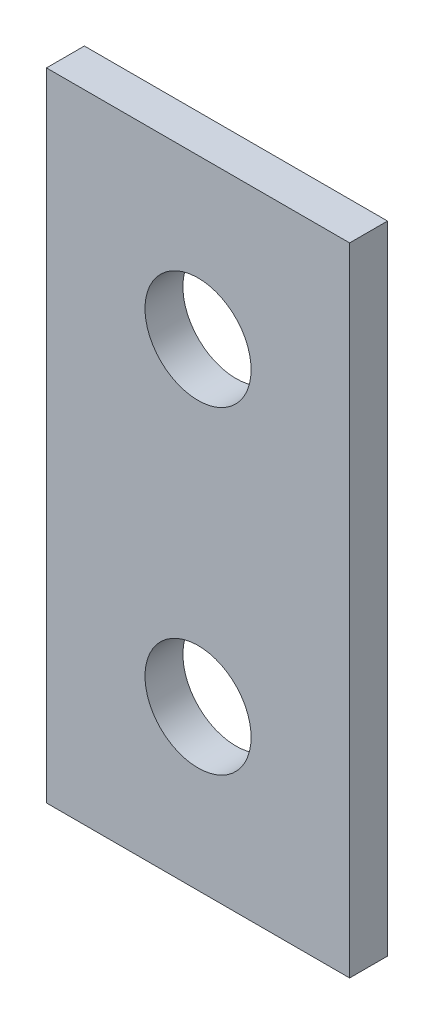
ISO-10303-21;
HEADER;
FILE_DESCRIPTION(('STEP AP214'),'2;1');
FILE_NAME('part.step','',(''),(''),'','','');
FILE_SCHEMA(('AUTOMOTIVE_DESIGN { 1 0 10303 214 1 1 1 1 }'));
ENDSEC;
DATA;
#1=APPLICATION_CONTEXT('core data for automotive mechanical design processes');
#2=APPLICATION_PROTOCOL_DEFINITION('international standard','automotive_design',2000,#1);
#3=PRODUCT_CONTEXT('',#1,'mechanical');
#4=PRODUCT('Part','Part','',(#3));
#5=PRODUCT_RELATED_PRODUCT_CATEGORY('part','',(#4));
#6=PRODUCT_DEFINITION_FORMATION('','',#4);
#7=PRODUCT_DEFINITION_CONTEXT('part definition',#1,'design');
#8=PRODUCT_DEFINITION('design','',#6,#7);
#9=PRODUCT_DEFINITION_SHAPE('','',#8);
#10=(LENGTH_UNIT() NAMED_UNIT(*) SI_UNIT(.MILLI.,.METRE.));
#11=(NAMED_UNIT(*) PLANE_ANGLE_UNIT() SI_UNIT($,.RADIAN.));
#12=(NAMED_UNIT(*) SI_UNIT($,.STERADIAN.) SOLID_ANGLE_UNIT());
#13=UNCERTAINTY_MEASURE_WITH_UNIT(LENGTH_MEASURE(1.E-05),#10,'distance_accuracy_value','');
#14=(GEOMETRIC_REPRESENTATION_CONTEXT(3) GLOBAL_UNCERTAINTY_ASSIGNED_CONTEXT((#13)) GLOBAL_UNIT_ASSIGNED_CONTEXT((#10,
#11,#12)) REPRESENTATION_CONTEXT('',''));
#15=CARTESIAN_POINT('',(0.,0.,0.));
#16=DIRECTION('',(0.,0.,1.));
#17=DIRECTION('',(1.,0.,0.));
#18=AXIS2_PLACEMENT_3D('',#15,#16,#17);
#19=CARTESIAN_POINT('',(40.,0.,5.));
#20=DIRECTION('',(0.,1.,0.));
#21=DIRECTION('',(-1.,0.,0.));
#22=AXIS2_PLACEMENT_3D('',#19,#20,#21);
#23=PLANE('',#22);
#24=DIRECTION('',(1.,0.,0.));
#25=VECTOR('',#24,1.);
#26=CARTESIAN_POINT('',(40.,0.,0.));
#27=LINE('',#26,#25);
#28=CARTESIAN_POINT('',(0.,0.,0.));
#29=VERTEX_POINT('',#28);
#30=CARTESIAN_POINT('',(40.,0.,0.));
#31=VERTEX_POINT('',#30);
#32=EDGE_CURVE('E113',#29,#31,#27,.T.);
#33=ORIENTED_EDGE('',*,*,#32,.T.);
#34=DIRECTION('',(0.,0.,-1.));
#35=VECTOR('',#34,1.);
#36=CARTESIAN_POINT('',(40.,0.,5.));
#37=LINE('',#36,#35);
#38=CARTESIAN_POINT('',(40.,0.,5.));
#39=VERTEX_POINT('',#38);
#40=EDGE_CURVE('E11',#39,#31,#37,.T.);
#41=ORIENTED_EDGE('',*,*,#40,.F.);
#42=DIRECTION('',(1.,0.,0.));
#43=VECTOR('',#42,1.);
#44=CARTESIAN_POINT('',(40.,0.,5.));
#45=LINE('',#44,#43);
#46=CARTESIAN_POINT('',(0.,0.,5.));
#47=VERTEX_POINT('',#46);
#48=EDGE_CURVE('E97',#47,#39,#45,.T.);
#49=ORIENTED_EDGE('',*,*,#48,.F.);
#50=DIRECTION('',(0.,0.,-1.));
#51=VECTOR('',#50,1.);
#52=CARTESIAN_POINT('',(0.,0.,5.));
#53=LINE('',#52,#51);
#54=EDGE_CURVE('E109',#47,#29,#53,.T.);
#55=ORIENTED_EDGE('',*,*,#54,.T.);
#56=EDGE_LOOP('',(#33,#41,#49,#55));
#57=FACE_BOUND('',#56,.T.);
#58=ADVANCED_FACE('F45',(#57),#23,.F.);
#59=CARTESIAN_POINT('',(40.,84.,5.));
#60=DIRECTION('',(-1.,0.,0.));
#61=DIRECTION('',(0.,-1.,0.));
#62=AXIS2_PLACEMENT_3D('',#59,#60,#61);
#63=PLANE('',#62);
#64=DIRECTION('',(0.,1.,0.));
#65=VECTOR('',#64,1.);
#66=CARTESIAN_POINT('',(40.,84.,0.));
#67=LINE('',#66,#65);
#68=CARTESIAN_POINT('',(40.,84.,0.));
#69=VERTEX_POINT('',#68);
#70=EDGE_CURVE('E102',#31,#69,#67,.T.);
#71=ORIENTED_EDGE('',*,*,#70,.T.);
#72=DIRECTION('',(0.,0.,-1.));
#73=VECTOR('',#72,1.);
#74=CARTESIAN_POINT('',(40.,84.,5.));
#75=LINE('',#74,#73);
#76=CARTESIAN_POINT('',(40.,84.,5.));
#77=VERTEX_POINT('',#76);
#78=EDGE_CURVE('E54',#77,#69,#75,.T.);
#79=ORIENTED_EDGE('',*,*,#78,.F.);
#80=DIRECTION('',(0.,1.,0.));
#81=VECTOR('',#80,1.);
#82=CARTESIAN_POINT('',(40.,84.,5.));
#83=LINE('',#82,#81);
#84=EDGE_CURVE('E92',#39,#77,#83,.T.);
#85=ORIENTED_EDGE('',*,*,#84,.F.);
#86=ORIENTED_EDGE('',*,*,#40,.T.);
#87=EDGE_LOOP('',(#71,#79,#85,#86));
#88=FACE_BOUND('',#87,.T.);
#89=ADVANCED_FACE('F101',(#88),#63,.F.);
#90=CARTESIAN_POINT('',(0.,84.,5.));
#91=DIRECTION('',(0.,-1.,0.));
#92=DIRECTION('',(0.,0.,-1.));
#93=AXIS2_PLACEMENT_3D('',#90,#91,#92);
#94=PLANE('',#93);
#95=DIRECTION('',(-1.,0.,0.));
#96=VECTOR('',#95,1.);
#97=CARTESIAN_POINT('',(0.,84.,0.));
#98=LINE('',#97,#96);
#99=CARTESIAN_POINT('',(0.,84.,0.));
#100=VERTEX_POINT('',#99);
#101=EDGE_CURVE('E79',#69,#100,#98,.T.);
#102=ORIENTED_EDGE('',*,*,#101,.T.);
#103=DIRECTION('',(0.,0.,-1.));
#104=VECTOR('',#103,1.);
#105=CARTESIAN_POINT('',(0.,84.,5.));
#106=LINE('',#105,#104);
#107=CARTESIAN_POINT('',(0.,84.,5.));
#108=VERTEX_POINT('',#107);
#109=EDGE_CURVE('E104',#108,#100,#106,.T.);
#110=ORIENTED_EDGE('',*,*,#109,.F.);
#111=DIRECTION('',(-1.,0.,0.));
#112=VECTOR('',#111,1.);
#113=CARTESIAN_POINT('',(0.,84.,5.));
#114=LINE('',#113,#112);
#115=EDGE_CURVE('E95',#77,#108,#114,.T.);
#116=ORIENTED_EDGE('',*,*,#115,.F.);
#117=ORIENTED_EDGE('',*,*,#78,.T.);
#118=EDGE_LOOP('',(#102,#110,#116,#117));
#119=FACE_BOUND('',#118,.T.);
#120=ADVANCED_FACE('F105',(#119),#94,.F.);
#121=CARTESIAN_POINT('',(0.,0.,5.));
#122=DIRECTION('',(1.,0.,0.));
#123=DIRECTION('',(0.,0.,-1.));
#124=AXIS2_PLACEMENT_3D('',#121,#122,#123);
#125=PLANE('',#124);
#126=DIRECTION('',(0.,-1.,0.));
#127=VECTOR('',#126,1.);
#128=CARTESIAN_POINT('',(0.,0.,0.));
#129=LINE('',#128,#127);
#130=EDGE_CURVE('E85',#100,#29,#129,.T.);
#131=ORIENTED_EDGE('',*,*,#130,.T.);
#132=ORIENTED_EDGE('',*,*,#54,.F.);
#133=DIRECTION('',(0.,-1.,0.));
#134=VECTOR('',#133,1.);
#135=CARTESIAN_POINT('',(0.,0.,5.));
#136=LINE('',#135,#134);
#137=EDGE_CURVE('E62',#108,#47,#136,.T.);
#138=ORIENTED_EDGE('',*,*,#137,.F.);
#139=ORIENTED_EDGE('',*,*,#109,.T.);
#140=EDGE_LOOP('',(#131,#132,#138,#139));
#141=FACE_BOUND('',#140,.T.);
#142=ADVANCED_FACE('F127',(#141),#125,.F.);
#143=CARTESIAN_POINT('',(0.,0.,5.));
#144=DIRECTION('',(0.,0.,-1.));
#145=DIRECTION('',(-1.,0.,0.));
#146=AXIS2_PLACEMENT_3D('',#143,#144,#145);
#147=PLANE('',#146);
#148=CARTESIAN_POINT('',(20.,21.,5.));
#149=DIRECTION('',(0.,0.,1.));
#150=DIRECTION('',(1.,0.,0.));
#151=AXIS2_PLACEMENT_3D('',#148,#149,#150);
#152=CIRCLE('',#151,7.);
#153=CARTESIAN_POINT('',(27.,21.,5.));
#154=VERTEX_POINT('',#153);
#155=EDGE_CURVE('E142',#154,#154,#152,.T.);
#156=ORIENTED_EDGE('',*,*,#155,.F.);
#157=EDGE_LOOP('',(#156));
#158=FACE_BOUND('',#157,.T.);
#159=CARTESIAN_POINT('',(20.,63.,5.));
#160=DIRECTION('',(0.,0.,1.));
#161=DIRECTION('',(1.,0.,0.));
#162=AXIS2_PLACEMENT_3D('',#159,#160,#161);
#163=CIRCLE('',#162,7.);
#164=CARTESIAN_POINT('',(27.,63.,5.));
#165=VERTEX_POINT('',#164);
#166=EDGE_CURVE('E134',#165,#165,#163,.T.);
#167=ORIENTED_EDGE('',*,*,#166,.F.);
#168=EDGE_LOOP('',(#167));
#169=FACE_BOUND('',#168,.T.);
#170=ORIENTED_EDGE('',*,*,#48,.T.);
#171=ORIENTED_EDGE('',*,*,#84,.T.);
#172=ORIENTED_EDGE('',*,*,#115,.T.);
#173=ORIENTED_EDGE('',*,*,#137,.T.);
#174=EDGE_LOOP('',(#170,#171,#172,#173));
#175=FACE_BOUND('',#174,.T.);
#176=ADVANCED_FACE('F93',(#158,#169,#175),#147,.F.);
#177=CARTESIAN_POINT('',(0.,0.,0.));
#178=DIRECTION('',(0.,0.,-1.));
#179=DIRECTION('',(-1.,0.,0.));
#180=AXIS2_PLACEMENT_3D('',#177,#178,#179);
#181=PLANE('',#180);
#182=CARTESIAN_POINT('',(20.,21.,0.));
#183=DIRECTION('',(0.,0.,1.));
#184=DIRECTION('',(1.,0.,0.));
#185=AXIS2_PLACEMENT_3D('',#182,#183,#184);
#186=CIRCLE('',#185,7.);
#187=CARTESIAN_POINT('',(27.,21.,0.));
#188=VERTEX_POINT('',#187);
#189=EDGE_CURVE('E138',#188,#188,#186,.T.);
#190=ORIENTED_EDGE('',*,*,#189,.T.);
#191=EDGE_LOOP('',(#190));
#192=FACE_BOUND('',#191,.T.);
#193=CARTESIAN_POINT('',(20.,63.,0.));
#194=DIRECTION('',(0.,0.,1.));
#195=DIRECTION('',(1.,0.,0.));
#196=AXIS2_PLACEMENT_3D('',#193,#194,#195);
#197=CIRCLE('',#196,7.);
#198=CARTESIAN_POINT('',(27.,63.,0.));
#199=VERTEX_POINT('',#198);
#200=EDGE_CURVE('E117',#199,#199,#197,.T.);
#201=ORIENTED_EDGE('',*,*,#200,.T.);
#202=EDGE_LOOP('',(#201));
#203=FACE_BOUND('',#202,.T.);
#204=ORIENTED_EDGE('',*,*,#32,.F.);
#205=ORIENTED_EDGE('',*,*,#130,.F.);
#206=ORIENTED_EDGE('',*,*,#101,.F.);
#207=ORIENTED_EDGE('',*,*,#70,.F.);
#208=EDGE_LOOP('',(#204,#205,#206,#207));
#209=FACE_BOUND('',#208,.T.);
#210=ADVANCED_FACE('F130',(#192,#203,#209),#181,.T.);
#211=CARTESIAN_POINT('',(20.,63.,0.));
#212=DIRECTION('',(0.,0.,1.));
#213=DIRECTION('',(1.,0.,0.));
#214=AXIS2_PLACEMENT_3D('',#211,#212,#213);
#215=CYLINDRICAL_SURFACE('',#214,7.);
#216=ORIENTED_EDGE('',*,*,#200,.F.);
#217=EDGE_LOOP('',(#216));
#218=FACE_BOUND('',#217,.T.);
#219=ORIENTED_EDGE('',*,*,#166,.T.);
#220=EDGE_LOOP('',(#219));
#221=FACE_BOUND('',#220,.T.);
#222=ADVANCED_FACE('F155',(#218,#221),#215,.F.);
#223=CARTESIAN_POINT('',(20.,21.,0.));
#224=DIRECTION('',(0.,0.,1.));
#225=DIRECTION('',(1.,0.,0.));
#226=AXIS2_PLACEMENT_3D('',#223,#224,#225);
#227=CYLINDRICAL_SURFACE('',#226,7.);
#228=ORIENTED_EDGE('',*,*,#189,.F.);
#229=EDGE_LOOP('',(#228));
#230=FACE_BOUND('',#229,.T.);
#231=ORIENTED_EDGE('',*,*,#155,.T.);
#232=EDGE_LOOP('',(#231));
#233=FACE_BOUND('',#232,.T.);
#234=ADVANCED_FACE('F152',(#230,#233),#227,.F.);
#235=CLOSED_SHELL('',(#58,#89,#120,#142,#176,#210,#222,#234));
#236=MANIFOLD_SOLID_BREP('B2',#235);
#237=ADVANCED_BREP_SHAPE_REPRESENTATION('',(#18,#236),#14);
#238=SHAPE_DEFINITION_REPRESENTATION(#9,#237);
ENDSEC;
END-ISO-10303-21;
